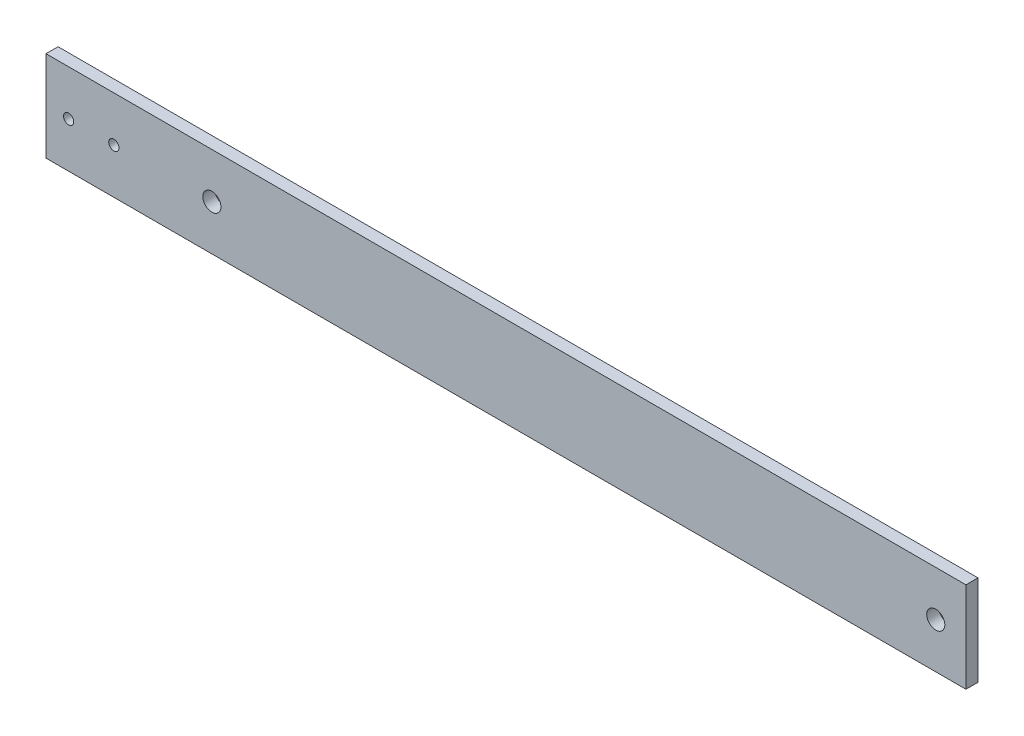
ISO-10303-21;
HEADER;
FILE_DESCRIPTION(('STEP AP214'),'2;1');
FILE_NAME('part.step','',(''),(''),'','','');
FILE_SCHEMA(('AUTOMOTIVE_DESIGN { 1 0 10303 214 1 1 1 1 }'));
ENDSEC;
DATA;
#1=APPLICATION_CONTEXT('core data for automotive mechanical design processes');
#2=APPLICATION_PROTOCOL_DEFINITION('international standard','automotive_design',2000,#1);
#3=PRODUCT_CONTEXT('',#1,'mechanical');
#4=PRODUCT('Part','Part','',(#3));
#5=PRODUCT_RELATED_PRODUCT_CATEGORY('part','',(#4));
#6=PRODUCT_DEFINITION_FORMATION('','',#4);
#7=PRODUCT_DEFINITION_CONTEXT('part definition',#1,'design');
#8=PRODUCT_DEFINITION('design','',#6,#7);
#9=PRODUCT_DEFINITION_SHAPE('','',#8);
#10=(LENGTH_UNIT() NAMED_UNIT(*) SI_UNIT(.MILLI.,.METRE.));
#11=(NAMED_UNIT(*) PLANE_ANGLE_UNIT() SI_UNIT($,.RADIAN.));
#12=(NAMED_UNIT(*) SI_UNIT($,.STERADIAN.) SOLID_ANGLE_UNIT());
#13=UNCERTAINTY_MEASURE_WITH_UNIT(LENGTH_MEASURE(1.E-05),#10,'distance_accuracy_value','');
#14=(GEOMETRIC_REPRESENTATION_CONTEXT(3) GLOBAL_UNCERTAINTY_ASSIGNED_CONTEXT((#13)) GLOBAL_UNIT_ASSIGNED_CONTEXT((#10,
#11,#12)) REPRESENTATION_CONTEXT('',''));
#15=CARTESIAN_POINT('',(0.,0.,0.));
#16=DIRECTION('',(0.,0.,1.));
#17=DIRECTION('',(1.,0.,0.));
#18=AXIS2_PLACEMENT_3D('',#15,#16,#17);
#19=CARTESIAN_POINT('',(305.,30.,8.));
#20=DIRECTION('',(-1.,0.,0.));
#21=DIRECTION('',(0.,-1.,0.));
#22=AXIS2_PLACEMENT_3D('',#19,#20,#21);
#23=PLANE('',#22);
#24=DIRECTION('',(0.,1.,0.));
#25=VECTOR('',#24,1.);
#26=CARTESIAN_POINT('',(305.,30.,0.));
#27=LINE('',#26,#25);
#28=CARTESIAN_POINT('',(305.,-30.,0.));
#29=VERTEX_POINT('',#28);
#30=CARTESIAN_POINT('',(305.,30.,0.));
#31=VERTEX_POINT('',#30);
#32=EDGE_CURVE('E109',#29,#31,#27,.T.);
#33=ORIENTED_EDGE('',*,*,#32,.T.);
#34=DIRECTION('',(0.,0.,-1.));
#35=VECTOR('',#34,1.);
#36=CARTESIAN_POINT('',(305.,30.,8.));
#37=LINE('',#36,#35);
#38=CARTESIAN_POINT('',(305.,30.,8.));
#39=VERTEX_POINT('',#38);
#40=EDGE_CURVE('E11',#39,#31,#37,.T.);
#41=ORIENTED_EDGE('',*,*,#40,.F.);
#42=DIRECTION('',(0.,1.,0.));
#43=VECTOR('',#42,1.);
#44=CARTESIAN_POINT('',(305.,30.,8.));
#45=LINE('',#44,#43);
#46=CARTESIAN_POINT('',(305.,-30.,8.));
#47=VERTEX_POINT('',#46);
#48=EDGE_CURVE('E93',#47,#39,#45,.T.);
#49=ORIENTED_EDGE('',*,*,#48,.F.);
#50=DIRECTION('',(0.,0.,-1.));
#51=VECTOR('',#50,1.);
#52=CARTESIAN_POINT('',(305.,-30.,8.));
#53=LINE('',#52,#51);
#54=EDGE_CURVE('E105',#47,#29,#53,.T.);
#55=ORIENTED_EDGE('',*,*,#54,.T.);
#56=EDGE_LOOP('',(#33,#41,#49,#55));
#57=FACE_BOUND('',#56,.T.);
#58=ADVANCED_FACE('F41',(#57),#23,.F.);
#59=CARTESIAN_POINT('',(-305.,30.,8.));
#60=DIRECTION('',(0.,-1.,0.));
#61=DIRECTION('',(0.,0.,-1.));
#62=AXIS2_PLACEMENT_3D('',#59,#60,#61);
#63=PLANE('',#62);
#64=DIRECTION('',(-1.,0.,0.));
#65=VECTOR('',#64,1.);
#66=CARTESIAN_POINT('',(-305.,30.,0.));
#67=LINE('',#66,#65);
#68=CARTESIAN_POINT('',(-305.,30.,0.));
#69=VERTEX_POINT('',#68);
#70=EDGE_CURVE('E98',#31,#69,#67,.T.);
#71=ORIENTED_EDGE('',*,*,#70,.T.);
#72=DIRECTION('',(0.,0.,-1.));
#73=VECTOR('',#72,1.);
#74=CARTESIAN_POINT('',(-305.,30.,8.));
#75=LINE('',#74,#73);
#76=CARTESIAN_POINT('',(-305.,30.,8.));
#77=VERTEX_POINT('',#76);
#78=EDGE_CURVE('E50',#77,#69,#75,.T.);
#79=ORIENTED_EDGE('',*,*,#78,.F.);
#80=DIRECTION('',(-1.,0.,0.));
#81=VECTOR('',#80,1.);
#82=CARTESIAN_POINT('',(-305.,30.,8.));
#83=LINE('',#82,#81);
#84=EDGE_CURVE('E88',#39,#77,#83,.T.);
#85=ORIENTED_EDGE('',*,*,#84,.F.);
#86=ORIENTED_EDGE('',*,*,#40,.T.);
#87=EDGE_LOOP('',(#71,#79,#85,#86));
#88=FACE_BOUND('',#87,.T.);
#89=ADVANCED_FACE('F97',(#88),#63,.F.);
#90=CARTESIAN_POINT('',(-305.,30.,8.));
#91=DIRECTION('',(1.,0.,0.));
#92=DIRECTION('',(0.,1.,0.));
#93=AXIS2_PLACEMENT_3D('',#90,#91,#92);
#94=PLANE('',#93);
#95=DIRECTION('',(0.,-1.,0.));
#96=VECTOR('',#95,1.);
#97=CARTESIAN_POINT('',(-305.,30.,0.));
#98=LINE('',#97,#96);
#99=CARTESIAN_POINT('',(-305.,-30.,0.));
#100=VERTEX_POINT('',#99);
#101=EDGE_CURVE('E75',#69,#100,#98,.T.);
#102=ORIENTED_EDGE('',*,*,#101,.T.);
#103=DIRECTION('',(0.,0.,-1.));
#104=VECTOR('',#103,1.);
#105=CARTESIAN_POINT('',(-305.,-30.,8.));
#106=LINE('',#105,#104);
#107=CARTESIAN_POINT('',(-305.,-30.,8.));
#108=VERTEX_POINT('',#107);
#109=EDGE_CURVE('E100',#108,#100,#106,.T.);
#110=ORIENTED_EDGE('',*,*,#109,.F.);
#111=DIRECTION('',(0.,-1.,0.));
#112=VECTOR('',#111,1.);
#113=CARTESIAN_POINT('',(-305.,30.,8.));
#114=LINE('',#113,#112);
#115=EDGE_CURVE('E91',#77,#108,#114,.T.);
#116=ORIENTED_EDGE('',*,*,#115,.F.);
#117=ORIENTED_EDGE('',*,*,#78,.T.);
#118=EDGE_LOOP('',(#102,#110,#116,#117));
#119=FACE_BOUND('',#118,.T.);
#120=ADVANCED_FACE('F101',(#119),#94,.F.);
#121=CARTESIAN_POINT('',(-305.,-30.,8.));
#122=DIRECTION('',(0.,1.,0.));
#123=DIRECTION('',(0.,0.,1.));
#124=AXIS2_PLACEMENT_3D('',#121,#122,#123);
#125=PLANE('',#124);
#126=DIRECTION('',(1.,0.,0.));
#127=VECTOR('',#126,1.);
#128=CARTESIAN_POINT('',(-305.,-30.,0.));
#129=LINE('',#128,#127);
#130=EDGE_CURVE('E81',#100,#29,#129,.T.);
#131=ORIENTED_EDGE('',*,*,#130,.T.);
#132=ORIENTED_EDGE('',*,*,#54,.F.);
#133=DIRECTION('',(1.,0.,0.));
#134=VECTOR('',#133,1.);
#135=CARTESIAN_POINT('',(-305.,-30.,8.));
#136=LINE('',#135,#134);
#137=EDGE_CURVE('E58',#108,#47,#136,.T.);
#138=ORIENTED_EDGE('',*,*,#137,.F.);
#139=ORIENTED_EDGE('',*,*,#109,.T.);
#140=EDGE_LOOP('',(#131,#132,#138,#139));
#141=FACE_BOUND('',#140,.T.);
#142=ADVANCED_FACE('F123',(#141),#125,.F.);
#143=CARTESIAN_POINT('',(0.,0.,8.));
#144=DIRECTION('',(0.,0.,1.));
#145=DIRECTION('',(1.,0.,0.));
#146=AXIS2_PLACEMENT_3D('',#143,#144,#145);
#147=PLANE('',#146);
#148=CARTESIAN_POINT('',(-260.,0.,8.));
#149=DIRECTION('',(0.,0.,1.));
#150=DIRECTION('',(1.,0.,0.));
#151=AXIS2_PLACEMENT_3D('',#148,#149,#150);
#152=CIRCLE('',#151,3.40000000000001);
#153=CARTESIAN_POINT('',(-256.6,0.,8.));
#154=VERTEX_POINT('',#153);
#155=EDGE_CURVE('E157',#154,#154,#152,.T.);
#156=ORIENTED_EDGE('',*,*,#155,.F.);
#157=EDGE_LOOP('',(#156));
#158=FACE_BOUND('',#157,.T.);
#159=CARTESIAN_POINT('',(-290.,0.,8.));
#160=DIRECTION('',(0.,0.,1.));
#161=DIRECTION('',(1.,0.,0.));
#162=AXIS2_PLACEMENT_3D('',#159,#160,#161);
#163=CIRCLE('',#162,3.40000000000001);
#164=CARTESIAN_POINT('',(-286.6,0.,8.));
#165=VERTEX_POINT('',#164);
#166=EDGE_CURVE('E149',#165,#165,#163,.T.);
#167=ORIENTED_EDGE('',*,*,#166,.F.);
#168=EDGE_LOOP('',(#167));
#169=FACE_BOUND('',#168,.T.);
#170=CARTESIAN_POINT('',(-195.,0.,8.));
#171=DIRECTION('',(0.,0.,1.));
#172=DIRECTION('',(1.,0.,0.));
#173=AXIS2_PLACEMENT_3D('',#170,#171,#172);
#174=CIRCLE('',#173,6.00000000000001);
#175=CARTESIAN_POINT('',(-189.,0.,8.));
#176=VERTEX_POINT('',#175);
#177=EDGE_CURVE('E141',#176,#176,#174,.T.);
#178=ORIENTED_EDGE('',*,*,#177,.F.);
#179=EDGE_LOOP('',(#178));
#180=FACE_BOUND('',#179,.T.);
#181=CARTESIAN_POINT('',(285.,0.,8.));
#182=DIRECTION('',(0.,0.,1.));
#183=DIRECTION('',(1.,0.,0.));
#184=AXIS2_PLACEMENT_3D('',#181,#182,#183);
#185=CIRCLE('',#184,6.00000000000001);
#186=CARTESIAN_POINT('',(291.,0.,8.));
#187=VERTEX_POINT('',#186);
#188=EDGE_CURVE('E133',#187,#187,#185,.T.);
#189=ORIENTED_EDGE('',*,*,#188,.F.);
#190=EDGE_LOOP('',(#189));
#191=FACE_BOUND('',#190,.T.);
#192=ORIENTED_EDGE('',*,*,#48,.T.);
#193=ORIENTED_EDGE('',*,*,#84,.T.);
#194=ORIENTED_EDGE('',*,*,#115,.T.);
#195=ORIENTED_EDGE('',*,*,#137,.T.);
#196=EDGE_LOOP('',(#192,#193,#194,#195));
#197=FACE_BOUND('',#196,.T.);
#198=ADVANCED_FACE('F89',(#158,#169,#180,#191,#197),#147,.T.);
#199=CARTESIAN_POINT('',(0.,0.,0.));
#200=DIRECTION('',(0.,0.,1.));
#201=DIRECTION('',(1.,0.,0.));
#202=AXIS2_PLACEMENT_3D('',#199,#200,#201);
#203=PLANE('',#202);
#204=CARTESIAN_POINT('',(-260.,0.,0.));
#205=DIRECTION('',(0.,0.,1.));
#206=DIRECTION('',(1.,0.,0.));
#207=AXIS2_PLACEMENT_3D('',#204,#205,#206);
#208=CIRCLE('',#207,3.40000000000001);
#209=CARTESIAN_POINT('',(-256.6,0.,0.));
#210=VERTEX_POINT('',#209);
#211=EDGE_CURVE('E153',#210,#210,#208,.T.);
#212=ORIENTED_EDGE('',*,*,#211,.T.);
#213=EDGE_LOOP('',(#212));
#214=FACE_BOUND('',#213,.T.);
#215=CARTESIAN_POINT('',(-290.,0.,0.));
#216=DIRECTION('',(0.,0.,1.));
#217=DIRECTION('',(1.,0.,0.));
#218=AXIS2_PLACEMENT_3D('',#215,#216,#217);
#219=CIRCLE('',#218,3.40000000000001);
#220=CARTESIAN_POINT('',(-286.6,0.,0.));
#221=VERTEX_POINT('',#220);
#222=EDGE_CURVE('E145',#221,#221,#219,.T.);
#223=ORIENTED_EDGE('',*,*,#222,.T.);
#224=EDGE_LOOP('',(#223));
#225=FACE_BOUND('',#224,.T.);
#226=CARTESIAN_POINT('',(-195.,0.,0.));
#227=DIRECTION('',(0.,0.,1.));
#228=DIRECTION('',(1.,0.,0.));
#229=AXIS2_PLACEMENT_3D('',#226,#227,#228);
#230=CIRCLE('',#229,6.00000000000001);
#231=CARTESIAN_POINT('',(-189.,0.,0.));
#232=VERTEX_POINT('',#231);
#233=EDGE_CURVE('E137',#232,#232,#230,.T.);
#234=ORIENTED_EDGE('',*,*,#233,.T.);
#235=EDGE_LOOP('',(#234));
#236=FACE_BOUND('',#235,.T.);
#237=CARTESIAN_POINT('',(285.,0.,0.));
#238=DIRECTION('',(0.,0.,1.));
#239=DIRECTION('',(1.,0.,0.));
#240=AXIS2_PLACEMENT_3D('',#237,#238,#239);
#241=CIRCLE('',#240,6.00000000000001);
#242=CARTESIAN_POINT('',(291.,0.,0.));
#243=VERTEX_POINT('',#242);
#244=EDGE_CURVE('E113',#243,#243,#241,.T.);
#245=ORIENTED_EDGE('',*,*,#244,.T.);
#246=EDGE_LOOP('',(#245));
#247=FACE_BOUND('',#246,.T.);
#248=ORIENTED_EDGE('',*,*,#32,.F.);
#249=ORIENTED_EDGE('',*,*,#130,.F.);
#250=ORIENTED_EDGE('',*,*,#101,.F.);
#251=ORIENTED_EDGE('',*,*,#70,.F.);
#252=EDGE_LOOP('',(#248,#249,#250,#251));
#253=FACE_BOUND('',#252,.T.);
#254=ADVANCED_FACE('F126',(#214,#225,#236,#247,#253),#203,.F.);
#255=CARTESIAN_POINT('',(285.,0.,8.));
#256=DIRECTION('',(0.,0.,1.));
#257=DIRECTION('',(1.,0.,0.));
#258=AXIS2_PLACEMENT_3D('',#255,#256,#257);
#259=CYLINDRICAL_SURFACE('',#258,6.00000000000001);
#260=ORIENTED_EDGE('',*,*,#244,.F.);
#261=EDGE_LOOP('',(#260));
#262=FACE_BOUND('',#261,.T.);
#263=ORIENTED_EDGE('',*,*,#188,.T.);
#264=EDGE_LOOP('',(#263));
#265=FACE_BOUND('',#264,.T.);
#266=ADVANCED_FACE('F173',(#262,#265),#259,.F.);
#267=CARTESIAN_POINT('',(-195.,0.,8.));
#268=DIRECTION('',(0.,0.,1.));
#269=DIRECTION('',(1.,0.,0.));
#270=AXIS2_PLACEMENT_3D('',#267,#268,#269);
#271=CYLINDRICAL_SURFACE('',#270,6.00000000000001);
#272=ORIENTED_EDGE('',*,*,#233,.F.);
#273=EDGE_LOOP('',(#272));
#274=FACE_BOUND('',#273,.T.);
#275=ORIENTED_EDGE('',*,*,#177,.T.);
#276=EDGE_LOOP('',(#275));
#277=FACE_BOUND('',#276,.T.);
#278=ADVANCED_FACE('F175',(#274,#277),#271,.F.);
#279=CARTESIAN_POINT('',(-290.,0.,8.));
#280=DIRECTION('',(0.,0.,1.));
#281=DIRECTION('',(1.,0.,0.));
#282=AXIS2_PLACEMENT_3D('',#279,#280,#281);
#283=CYLINDRICAL_SURFACE('',#282,3.40000000000001);
#284=ORIENTED_EDGE('',*,*,#222,.F.);
#285=EDGE_LOOP('',(#284));
#286=FACE_BOUND('',#285,.T.);
#287=ORIENTED_EDGE('',*,*,#166,.T.);
#288=EDGE_LOOP('',(#287));
#289=FACE_BOUND('',#288,.T.);
#290=ADVANCED_FACE('F182',(#286,#289),#283,.F.);
#291=CARTESIAN_POINT('',(-260.,0.,8.));
#292=DIRECTION('',(0.,0.,1.));
#293=DIRECTION('',(1.,0.,0.));
#294=AXIS2_PLACEMENT_3D('',#291,#292,#293);
#295=CYLINDRICAL_SURFACE('',#294,3.40000000000001);
#296=ORIENTED_EDGE('',*,*,#211,.F.);
#297=EDGE_LOOP('',(#296));
#298=FACE_BOUND('',#297,.T.);
#299=ORIENTED_EDGE('',*,*,#155,.T.);
#300=EDGE_LOOP('',(#299));
#301=FACE_BOUND('',#300,.T.);
#302=ADVANCED_FACE('F162',(#298,#301),#295,.F.);
#303=CLOSED_SHELL('',(#58,#89,#120,#142,#198,#254,#266,#278,#290,#302));
#304=MANIFOLD_SOLID_BREP('B2',#303);
#305=ADVANCED_BREP_SHAPE_REPRESENTATION('',(#18,#304),#14);
#306=SHAPE_DEFINITION_REPRESENTATION(#9,#305);
ENDSEC;
END-ISO-10303-21;
